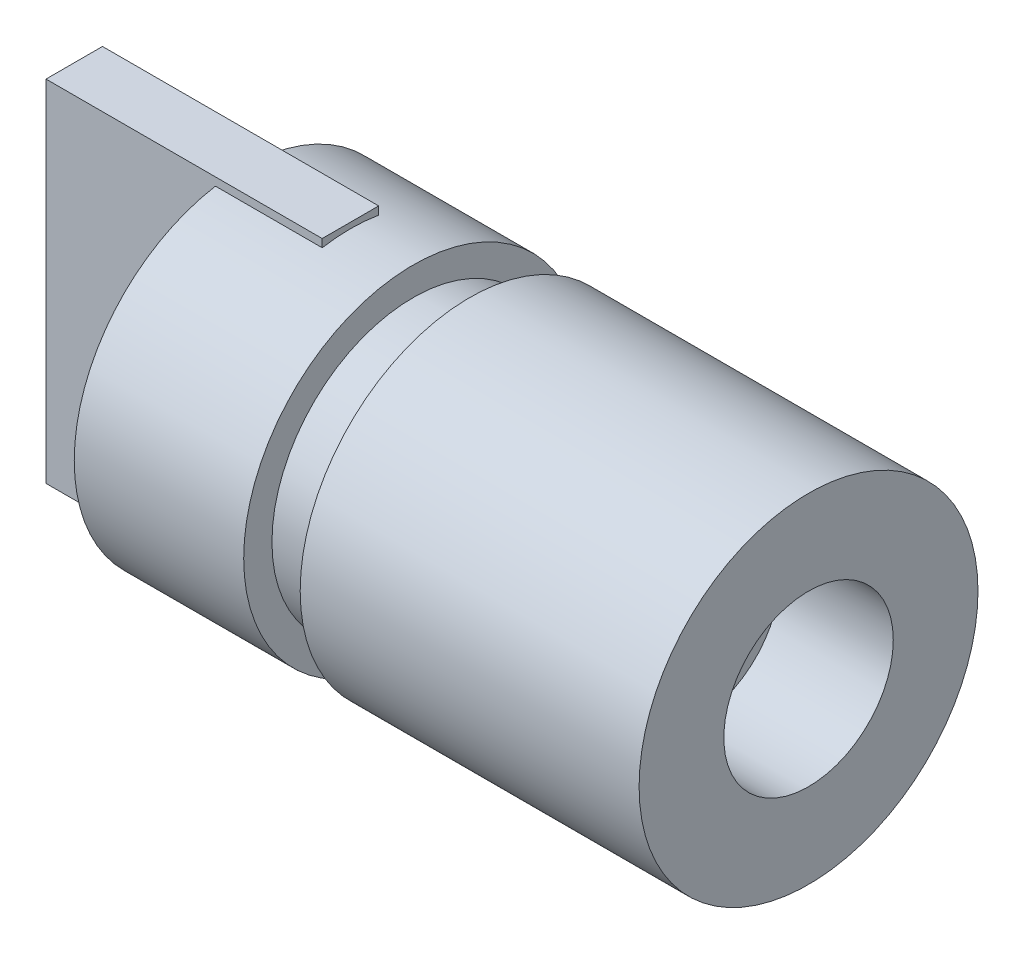
ISO-10303-21;
HEADER;
FILE_DESCRIPTION(('STEP AP214'),'2;1');
FILE_NAME('part.step','',(''),(''),'','','');
FILE_SCHEMA(('AUTOMOTIVE_DESIGN { 1 0 10303 214 1 1 1 1 }'));
ENDSEC;
DATA;
#1=APPLICATION_CONTEXT('core data for automotive mechanical design processes');
#2=APPLICATION_PROTOCOL_DEFINITION('international standard','automotive_design',2000,#1);
#3=PRODUCT_CONTEXT('',#1,'mechanical');
#4=PRODUCT('Part','Part','',(#3));
#5=PRODUCT_RELATED_PRODUCT_CATEGORY('part','',(#4));
#6=PRODUCT_DEFINITION_FORMATION('','',#4);
#7=PRODUCT_DEFINITION_CONTEXT('part definition',#1,'design');
#8=PRODUCT_DEFINITION('design','',#6,#7);
#9=PRODUCT_DEFINITION_SHAPE('','',#8);
#10=(LENGTH_UNIT() NAMED_UNIT(*) SI_UNIT(.MILLI.,.METRE.));
#11=(NAMED_UNIT(*) PLANE_ANGLE_UNIT() SI_UNIT($,.RADIAN.));
#12=(NAMED_UNIT(*) SI_UNIT($,.STERADIAN.) SOLID_ANGLE_UNIT());
#13=UNCERTAINTY_MEASURE_WITH_UNIT(LENGTH_MEASURE(1.E-05),#10,'distance_accuracy_value','');
#14=(GEOMETRIC_REPRESENTATION_CONTEXT(3) GLOBAL_UNCERTAINTY_ASSIGNED_CONTEXT((#13)) GLOBAL_UNIT_ASSIGNED_CONTEXT((#10,
#11,#12)) REPRESENTATION_CONTEXT('',''));
#15=CARTESIAN_POINT('',(0.,0.,0.));
#16=DIRECTION('',(0.,0.,1.));
#17=DIRECTION('',(1.,0.,0.));
#18=AXIS2_PLACEMENT_3D('',#15,#16,#17);
#19=CARTESIAN_POINT('',(0.,0.,0.));
#20=DIRECTION('',(1.,0.,0.));
#21=DIRECTION('',(0.,0.,-1.));
#22=AXIS2_PLACEMENT_3D('',#19,#20,#21);
#23=PLANE('',#22);
#24=DIRECTION('',(0.,-1.,0.));
#25=VECTOR('',#24,1.);
#26=CARTESIAN_POINT('',(0.,0.,-0.5));
#27=LINE('',#26,#25);
#28=CARTESIAN_POINT('',(0.,2.95803989154981,-0.5));
#29=VERTEX_POINT('',#28);
#30=CARTESIAN_POINT('',(0.,-2.95803989154981,-0.5));
#31=VERTEX_POINT('',#30);
#32=EDGE_CURVE('E152',#29,#31,#27,.T.);
#33=ORIENTED_EDGE('',*,*,#32,.F.);
#34=CARTESIAN_POINT('',(0.,0.,0.));
#35=DIRECTION('',(1.,0.,0.));
#36=DIRECTION('',(0.,0.,-1.));
#37=AXIS2_PLACEMENT_3D('',#34,#35,#36);
#38=CIRCLE('',#37,3.);
#39=EDGE_CURVE('E148',#31,#29,#38,.T.);
#40=ORIENTED_EDGE('',*,*,#39,.F.);
#41=EDGE_LOOP('',(#33,#40));
#42=FACE_BOUND('',#41,.T.);
#43=ADVANCED_FACE('F32',(#42),#23,.F.);
#44=CARTESIAN_POINT('',(10.,0.,0.));
#45=DIRECTION('',(-1.,0.,0.));
#46=DIRECTION('',(0.,0.,1.));
#47=AXIS2_PLACEMENT_3D('',#44,#45,#46);
#48=CYLINDRICAL_SURFACE('',#47,3.);
#49=CARTESIAN_POINT('',(1.88965854340739,0.,0.));
#50=DIRECTION('',(-1.,0.,0.));
#51=DIRECTION('',(0.,-1.,0.));
#52=AXIS2_PLACEMENT_3D('',#49,#50,#51);
#53=CIRCLE('',#52,3.);
#54=CARTESIAN_POINT('',(1.88965854340739,2.95803989154981,0.5));
#55=VERTEX_POINT('',#54);
#56=CARTESIAN_POINT('',(1.88965854340739,2.95803989154981,-0.5));
#57=VERTEX_POINT('',#56);
#58=EDGE_CURVE('E11',#55,#57,#53,.T.);
#59=ORIENTED_EDGE('',*,*,#58,.F.);
#60=DIRECTION('',(-1.,0.,0.));
#61=VECTOR('',#60,1.);
#62=CARTESIAN_POINT('',(10.,2.95803989154981,0.5));
#63=LINE('',#62,#61);
#64=CARTESIAN_POINT('',(0.,2.95803989154981,0.5));
#65=VERTEX_POINT('',#64);
#66=EDGE_CURVE('E99',#55,#65,#63,.T.);
#67=ORIENTED_EDGE('',*,*,#66,.T.);
#68=CARTESIAN_POINT('',(0.,-2.95803989154981,0.5));
#69=VERTEX_POINT('',#68);
#70=EDGE_CURVE('E153',#65,#69,#38,.T.);
#71=ORIENTED_EDGE('',*,*,#70,.T.);
#72=DIRECTION('',(-1.,0.,0.));
#73=VECTOR('',#72,1.);
#74=CARTESIAN_POINT('',(10.,-2.95803989154981,0.5));
#75=LINE('',#74,#73);
#76=CARTESIAN_POINT('',(1.88965854340739,-2.95803989154981,0.5));
#77=VERTEX_POINT('',#76);
#78=EDGE_CURVE('E127',#69,#77,#75,.F.);
#79=ORIENTED_EDGE('',*,*,#78,.T.);
#80=CARTESIAN_POINT('',(1.88965854340739,-2.95803989154981,-0.5));
#81=VERTEX_POINT('',#80);
#82=EDGE_CURVE('E36',#81,#77,#53,.T.);
#83=ORIENTED_EDGE('',*,*,#82,.F.);
#84=DIRECTION('',(-1.,0.,0.));
#85=VECTOR('',#84,1.);
#86=CARTESIAN_POINT('',(10.,-2.95803989154981,-0.5));
#87=LINE('',#86,#85);
#88=EDGE_CURVE('E118',#31,#81,#87,.F.);
#89=ORIENTED_EDGE('',*,*,#88,.F.);
#90=ORIENTED_EDGE('',*,*,#39,.T.);
#91=DIRECTION('',(-1.,0.,0.));
#92=VECTOR('',#91,1.);
#93=CARTESIAN_POINT('',(10.,2.95803989154981,-0.5));
#94=LINE('',#93,#92);
#95=EDGE_CURVE('E50',#57,#29,#94,.T.);
#96=ORIENTED_EDGE('',*,*,#95,.F.);
#97=EDGE_LOOP('',(#59,#67,#71,#79,#83,#89,#90,#96));
#98=FACE_BOUND('',#97,.T.);
#99=CARTESIAN_POINT('',(2.99999999999989,0.,0.));
#100=DIRECTION('',(-1.,0.,0.));
#101=DIRECTION('',(0.,0.,1.));
#102=AXIS2_PLACEMENT_3D('',#99,#100,#101);
#103=CIRCLE('',#102,3.);
#104=CARTESIAN_POINT('',(2.99999999999989,0.,3.));
#105=VERTEX_POINT('',#104);
#106=EDGE_CURVE('E145',#105,#105,#103,.T.);
#107=ORIENTED_EDGE('',*,*,#106,.T.);
#108=EDGE_LOOP('',(#107));
#109=FACE_BOUND('',#108,.T.);
#110=ADVANCED_FACE('F34',(#98,#109),#48,.T.);
#111=ORIENTED_EDGE('',*,*,#70,.F.);
#112=DIRECTION('',(0.,-1.,0.));
#113=VECTOR('',#112,1.);
#114=CARTESIAN_POINT('',(0.,0.,0.5));
#115=LINE('',#114,#113);
#116=EDGE_CURVE('E156',#65,#69,#115,.T.);
#117=ORIENTED_EDGE('',*,*,#116,.T.);
#118=EDGE_LOOP('',(#111,#117));
#119=FACE_BOUND('',#118,.T.);
#120=ADVANCED_FACE('F205',(#119),#23,.F.);
#121=CARTESIAN_POINT('',(3.,3.,0.));
#122=DIRECTION('',(1.,0.,0.));
#123=DIRECTION('',(0.,0.,-1.));
#124=AXIS2_PLACEMENT_3D('',#121,#122,#123);
#125=PLANE('',#124);
#126=CARTESIAN_POINT('',(2.99999999999989,0.,0.));
#127=DIRECTION('',(-1.,0.,0.));
#128=DIRECTION('',(0.,0.,1.));
#129=AXIS2_PLACEMENT_3D('',#126,#127,#128);
#130=CIRCLE('',#129,2.5);
#131=CARTESIAN_POINT('',(2.99999999999989,0.,2.5));
#132=VERTEX_POINT('',#131);
#133=EDGE_CURVE('E142',#132,#132,#130,.T.);
#134=ORIENTED_EDGE('',*,*,#133,.T.);
#135=EDGE_LOOP('',(#134));
#136=FACE_BOUND('',#135,.T.);
#137=ORIENTED_EDGE('',*,*,#106,.F.);
#138=EDGE_LOOP('',(#137));
#139=FACE_BOUND('',#138,.T.);
#140=ADVANCED_FACE('F212',(#136,#139),#125,.T.);
#141=CARTESIAN_POINT('',(-1000.,0.,0.));
#142=DIRECTION('',(-1.,0.,0.));
#143=DIRECTION('',(0.,0.,1.));
#144=AXIS2_PLACEMENT_3D('',#141,#142,#143);
#145=CYLINDRICAL_SURFACE('',#144,2.5);
#146=CARTESIAN_POINT('',(4.,0.,0.));
#147=DIRECTION('',(-1.,0.,0.));
#148=DIRECTION('',(0.,0.,1.));
#149=AXIS2_PLACEMENT_3D('',#146,#147,#148);
#150=CIRCLE('',#149,2.5);
#151=CARTESIAN_POINT('',(4.,0.,2.5));
#152=VERTEX_POINT('',#151);
#153=EDGE_CURVE('E139',#152,#152,#150,.T.);
#154=ORIENTED_EDGE('',*,*,#153,.T.);
#155=EDGE_LOOP('',(#154));
#156=FACE_BOUND('',#155,.T.);
#157=ORIENTED_EDGE('',*,*,#133,.F.);
#158=EDGE_LOOP('',(#157));
#159=FACE_BOUND('',#158,.T.);
#160=ADVANCED_FACE('F216',(#156,#159),#145,.T.);
#161=CARTESIAN_POINT('',(4.,2.5,0.));
#162=DIRECTION('',(-1.,0.,0.));
#163=DIRECTION('',(0.,0.,1.));
#164=AXIS2_PLACEMENT_3D('',#161,#162,#163);
#165=PLANE('',#164);
#166=CARTESIAN_POINT('',(4.,0.,0.));
#167=DIRECTION('',(-1.,0.,0.));
#168=DIRECTION('',(0.,0.,1.));
#169=AXIS2_PLACEMENT_3D('',#166,#167,#168);
#170=CIRCLE('',#169,3.);
#171=CARTESIAN_POINT('',(4.,0.,3.));
#172=VERTEX_POINT('',#171);
#173=EDGE_CURVE('E134',#172,#172,#170,.T.);
#174=ORIENTED_EDGE('',*,*,#173,.T.);
#175=EDGE_LOOP('',(#174));
#176=FACE_BOUND('',#175,.T.);
#177=ORIENTED_EDGE('',*,*,#153,.F.);
#178=EDGE_LOOP('',(#177));
#179=FACE_BOUND('',#178,.T.);
#180=ADVANCED_FACE('F222',(#176,#179),#165,.T.);
#181=CARTESIAN_POINT('',(10.,0.,0.));
#182=DIRECTION('',(1.,0.,0.));
#183=DIRECTION('',(0.,0.,-1.));
#184=AXIS2_PLACEMENT_3D('',#181,#182,#183);
#185=PLANE('',#184);
#186=CARTESIAN_POINT('',(10.,0.,0.));
#187=DIRECTION('',(1.,0.,0.));
#188=DIRECTION('',(0.,0.,-1.));
#189=AXIS2_PLACEMENT_3D('',#186,#187,#188);
#190=CIRCLE('',#189,1.5);
#191=CARTESIAN_POINT('',(10.,0.,-1.5));
#192=VERTEX_POINT('',#191);
#193=EDGE_CURVE('E130',#192,#192,#190,.T.);
#194=ORIENTED_EDGE('',*,*,#193,.F.);
#195=EDGE_LOOP('',(#194));
#196=FACE_BOUND('',#195,.T.);
#197=CARTESIAN_POINT('',(10.,0.,0.));
#198=DIRECTION('',(1.,0.,0.));
#199=DIRECTION('',(0.,0.,-1.));
#200=AXIS2_PLACEMENT_3D('',#197,#198,#199);
#201=CIRCLE('',#200,3.);
#202=CARTESIAN_POINT('',(10.,0.,-3.));
#203=VERTEX_POINT('',#202);
#204=EDGE_CURVE('E149',#203,#203,#201,.T.);
#205=ORIENTED_EDGE('',*,*,#204,.T.);
#206=EDGE_LOOP('',(#205));
#207=FACE_BOUND('',#206,.T.);
#208=ADVANCED_FACE('F227',(#196,#207),#185,.T.);
#209=ORIENTED_EDGE('',*,*,#204,.F.);
#210=EDGE_LOOP('',(#209));
#211=FACE_BOUND('',#210,.T.);
#212=ORIENTED_EDGE('',*,*,#173,.F.);
#213=EDGE_LOOP('',(#212));
#214=FACE_BOUND('',#213,.T.);
#215=ADVANCED_FACE('F209',(#211,#214),#48,.T.);
#216=CARTESIAN_POINT('',(8.,0.,0.));
#217=DIRECTION('',(1.,0.,0.));
#218=DIRECTION('',(0.,0.,-1.));
#219=AXIS2_PLACEMENT_3D('',#216,#217,#218);
#220=CYLINDRICAL_SURFACE('',#219,1.5);
#221=CARTESIAN_POINT('',(8.,0.,0.));
#222=DIRECTION('',(1.,0.,0.));
#223=DIRECTION('',(0.,0.,-1.));
#224=AXIS2_PLACEMENT_3D('',#221,#222,#223);
#225=CIRCLE('',#224,1.5);
#226=CARTESIAN_POINT('',(8.,0.,-1.5));
#227=VERTEX_POINT('',#226);
#228=EDGE_CURVE('E131',#227,#227,#225,.T.);
#229=ORIENTED_EDGE('',*,*,#228,.F.);
#230=EDGE_LOOP('',(#229));
#231=FACE_BOUND('',#230,.T.);
#232=ORIENTED_EDGE('',*,*,#193,.T.);
#233=EDGE_LOOP('',(#232));
#234=FACE_BOUND('',#233,.T.);
#235=ADVANCED_FACE('F234',(#231,#234),#220,.F.);
#236=CARTESIAN_POINT('',(8.,0.,0.));
#237=DIRECTION('',(1.,0.,0.));
#238=DIRECTION('',(0.,0.,-1.));
#239=AXIS2_PLACEMENT_3D('',#236,#237,#238);
#240=PLANE('',#239);
#241=ORIENTED_EDGE('',*,*,#228,.T.);
#242=EDGE_LOOP('',(#241));
#243=FACE_BOUND('',#242,.T.);
#244=ADVANCED_FACE('F248',(#243),#240,.T.);
#245=CARTESIAN_POINT('',(1.88965854340739,-3.1,0.5));
#246=DIRECTION('',(-1.,0.,0.));
#247=DIRECTION('',(0.,-1.,0.));
#248=AXIS2_PLACEMENT_3D('',#245,#246,#247);
#249=PLANE('',#248);
#250=DIRECTION('',(0.,1.,0.));
#251=VECTOR('',#250,1.);
#252=CARTESIAN_POINT('',(1.88965854340739,-3.1,0.5));
#253=LINE('',#252,#251);
#254=CARTESIAN_POINT('',(1.88965854340739,3.1,0.5));
#255=VERTEX_POINT('',#254);
#256=EDGE_CURVE('E93',#55,#255,#253,.T.);
#257=ORIENTED_EDGE('',*,*,#256,.F.);
#258=ORIENTED_EDGE('',*,*,#58,.T.);
#259=DIRECTION('',(0.,1.,0.));
#260=VECTOR('',#259,1.);
#261=CARTESIAN_POINT('',(1.88965854340739,-3.1,-0.5));
#262=LINE('',#261,#260);
#263=CARTESIAN_POINT('',(1.88965854340739,3.1,-0.5));
#264=VERTEX_POINT('',#263);
#265=EDGE_CURVE('E116',#57,#264,#262,.T.);
#266=ORIENTED_EDGE('',*,*,#265,.T.);
#267=DIRECTION('',(0.,0.,-1.));
#268=VECTOR('',#267,1.);
#269=CARTESIAN_POINT('',(1.88965854340739,3.1,0.5));
#270=LINE('',#269,#268);
#271=EDGE_CURVE('E108',#255,#264,#270,.T.);
#272=ORIENTED_EDGE('',*,*,#271,.F.);
#273=EDGE_LOOP('',(#257,#258,#266,#272));
#274=FACE_BOUND('',#273,.T.);
#275=ADVANCED_FACE('F114',(#274),#249,.F.);
#276=CARTESIAN_POINT('',(0.,0.,0.5));
#277=DIRECTION('',(0.,0.,1.));
#278=DIRECTION('',(1.,0.,0.));
#279=AXIS2_PLACEMENT_3D('',#276,#277,#278);
#280=PLANE('',#279);
#281=ORIENTED_EDGE('',*,*,#66,.F.);
#282=ORIENTED_EDGE('',*,*,#256,.T.);
#283=DIRECTION('',(-1.,0.,0.));
#284=VECTOR('',#283,1.);
#285=CARTESIAN_POINT('',(1.88965854340739,3.1,0.5));
#286=LINE('',#285,#284);
#287=CARTESIAN_POINT('',(-3.,3.1,0.5));
#288=VERTEX_POINT('',#287);
#289=EDGE_CURVE('E96',#255,#288,#286,.T.);
#290=ORIENTED_EDGE('',*,*,#289,.T.);
#291=DIRECTION('',(0.,-1.,0.));
#292=VECTOR('',#291,1.);
#293=CARTESIAN_POINT('',(-3.,3.1,0.5));
#294=LINE('',#293,#292);
#295=CARTESIAN_POINT('',(-3.,-3.1,0.5));
#296=VERTEX_POINT('',#295);
#297=EDGE_CURVE('E112',#288,#296,#294,.T.);
#298=ORIENTED_EDGE('',*,*,#297,.T.);
#299=DIRECTION('',(1.,0.,0.));
#300=VECTOR('',#299,1.);
#301=CARTESIAN_POINT('',(-3.,-3.1,0.5));
#302=LINE('',#301,#300);
#303=CARTESIAN_POINT('',(1.88965854340739,-3.1,0.5));
#304=VERTEX_POINT('',#303);
#305=EDGE_CURVE('E172',#296,#304,#302,.T.);
#306=ORIENTED_EDGE('',*,*,#305,.T.);
#307=EDGE_CURVE('E102',#304,#77,#253,.T.);
#308=ORIENTED_EDGE('',*,*,#307,.T.);
#309=ORIENTED_EDGE('',*,*,#78,.F.);
#310=ORIENTED_EDGE('',*,*,#116,.F.);
#311=EDGE_LOOP('',(#281,#282,#290,#298,#306,#308,#309,#310));
#312=FACE_BOUND('',#311,.T.);
#313=ADVANCED_FACE('F95',(#312),#280,.T.);
#314=CARTESIAN_POINT('',(0.,0.,-0.5));
#315=DIRECTION('',(0.,0.,1.));
#316=DIRECTION('',(1.,0.,0.));
#317=AXIS2_PLACEMENT_3D('',#314,#315,#316);
#318=PLANE('',#317);
#319=ORIENTED_EDGE('',*,*,#265,.F.);
#320=ORIENTED_EDGE('',*,*,#95,.T.);
#321=ORIENTED_EDGE('',*,*,#32,.T.);
#322=ORIENTED_EDGE('',*,*,#88,.T.);
#323=CARTESIAN_POINT('',(1.88965854340739,-3.1,-0.5));
#324=VERTEX_POINT('',#323);
#325=EDGE_CURVE('E168',#324,#81,#262,.T.);
#326=ORIENTED_EDGE('',*,*,#325,.F.);
#327=DIRECTION('',(1.,0.,0.));
#328=VECTOR('',#327,1.);
#329=CARTESIAN_POINT('',(-3.,-3.1,-0.5));
#330=LINE('',#329,#328);
#331=CARTESIAN_POINT('',(-3.,-3.1,-0.5));
#332=VERTEX_POINT('',#331);
#333=EDGE_CURVE('E103',#332,#324,#330,.T.);
#334=ORIENTED_EDGE('',*,*,#333,.F.);
#335=DIRECTION('',(0.,-1.,0.));
#336=VECTOR('',#335,1.);
#337=CARTESIAN_POINT('',(-3.,3.1,-0.5));
#338=LINE('',#337,#336);
#339=CARTESIAN_POINT('',(-3.,3.1,-0.5));
#340=VERTEX_POINT('',#339);
#341=EDGE_CURVE('E181',#340,#332,#338,.T.);
#342=ORIENTED_EDGE('',*,*,#341,.F.);
#343=DIRECTION('',(-1.,0.,0.));
#344=VECTOR('',#343,1.);
#345=CARTESIAN_POINT('',(1.88965854340739,3.1,-0.5));
#346=LINE('',#345,#344);
#347=EDGE_CURVE('E179',#264,#340,#346,.T.);
#348=ORIENTED_EDGE('',*,*,#347,.F.);
#349=EDGE_LOOP('',(#319,#320,#321,#322,#326,#334,#342,#348));
#350=FACE_BOUND('',#349,.T.);
#351=ADVANCED_FACE('F192',(#350),#318,.F.);
#352=ORIENTED_EDGE('',*,*,#325,.T.);
#353=ORIENTED_EDGE('',*,*,#82,.T.);
#354=ORIENTED_EDGE('',*,*,#307,.F.);
#355=DIRECTION('',(0.,0.,-1.));
#356=VECTOR('',#355,1.);
#357=CARTESIAN_POINT('',(1.88965854340739,-3.1,0.5));
#358=LINE('',#357,#356);
#359=EDGE_CURVE('E177',#304,#324,#358,.T.);
#360=ORIENTED_EDGE('',*,*,#359,.T.);
#361=EDGE_LOOP('',(#352,#353,#354,#360));
#362=FACE_BOUND('',#361,.T.);
#363=ADVANCED_FACE('F165',(#362),#249,.F.);
#364=CARTESIAN_POINT('',(1.88965854340739,3.1,0.5));
#365=DIRECTION('',(0.,-1.,0.));
#366=DIRECTION('',(1.,0.,0.));
#367=AXIS2_PLACEMENT_3D('',#364,#365,#366);
#368=PLANE('',#367);
#369=ORIENTED_EDGE('',*,*,#347,.T.);
#370=DIRECTION('',(0.,0.,-1.));
#371=VECTOR('',#370,1.);
#372=CARTESIAN_POINT('',(-3.,3.1,0.5));
#373=LINE('',#372,#371);
#374=EDGE_CURVE('E110',#288,#340,#373,.T.);
#375=ORIENTED_EDGE('',*,*,#374,.F.);
#376=ORIENTED_EDGE('',*,*,#289,.F.);
#377=ORIENTED_EDGE('',*,*,#271,.T.);
#378=EDGE_LOOP('',(#369,#375,#376,#377));
#379=FACE_BOUND('',#378,.T.);
#380=ADVANCED_FACE('F107',(#379),#368,.F.);
#381=CARTESIAN_POINT('',(-3.,3.1,0.5));
#382=DIRECTION('',(1.,0.,0.));
#383=DIRECTION('',(0.,1.,0.));
#384=AXIS2_PLACEMENT_3D('',#381,#382,#383);
#385=PLANE('',#384);
#386=ORIENTED_EDGE('',*,*,#341,.T.);
#387=DIRECTION('',(0.,0.,-1.));
#388=VECTOR('',#387,1.);
#389=CARTESIAN_POINT('',(-3.,-3.1,0.5));
#390=LINE('',#389,#388);
#391=EDGE_CURVE('E122',#296,#332,#390,.T.);
#392=ORIENTED_EDGE('',*,*,#391,.F.);
#393=ORIENTED_EDGE('',*,*,#297,.F.);
#394=ORIENTED_EDGE('',*,*,#374,.T.);
#395=EDGE_LOOP('',(#386,#392,#393,#394));
#396=FACE_BOUND('',#395,.T.);
#397=ADVANCED_FACE('F195',(#396),#385,.F.);
#398=CARTESIAN_POINT('',(-3.,-3.1,0.5));
#399=DIRECTION('',(0.,1.,0.));
#400=DIRECTION('',(0.,0.,1.));
#401=AXIS2_PLACEMENT_3D('',#398,#399,#400);
#402=PLANE('',#401);
#403=ORIENTED_EDGE('',*,*,#333,.T.);
#404=ORIENTED_EDGE('',*,*,#359,.F.);
#405=ORIENTED_EDGE('',*,*,#305,.F.);
#406=ORIENTED_EDGE('',*,*,#391,.T.);
#407=EDGE_LOOP('',(#403,#404,#405,#406));
#408=FACE_BOUND('',#407,.T.);
#409=ADVANCED_FACE('F188',(#408),#402,.F.);
#410=CLOSED_SHELL('',(#43,#110,#120,#140,#160,#180,#208,#215,#235,#244,#275,#313,#351,#363,#380,
#397,#409));
#411=MANIFOLD_SOLID_BREP('B2',#410);
#412=ADVANCED_BREP_SHAPE_REPRESENTATION('',(#18,#411),#14);
#413=SHAPE_DEFINITION_REPRESENTATION(#9,#412);
ENDSEC;
END-ISO-10303-21;
